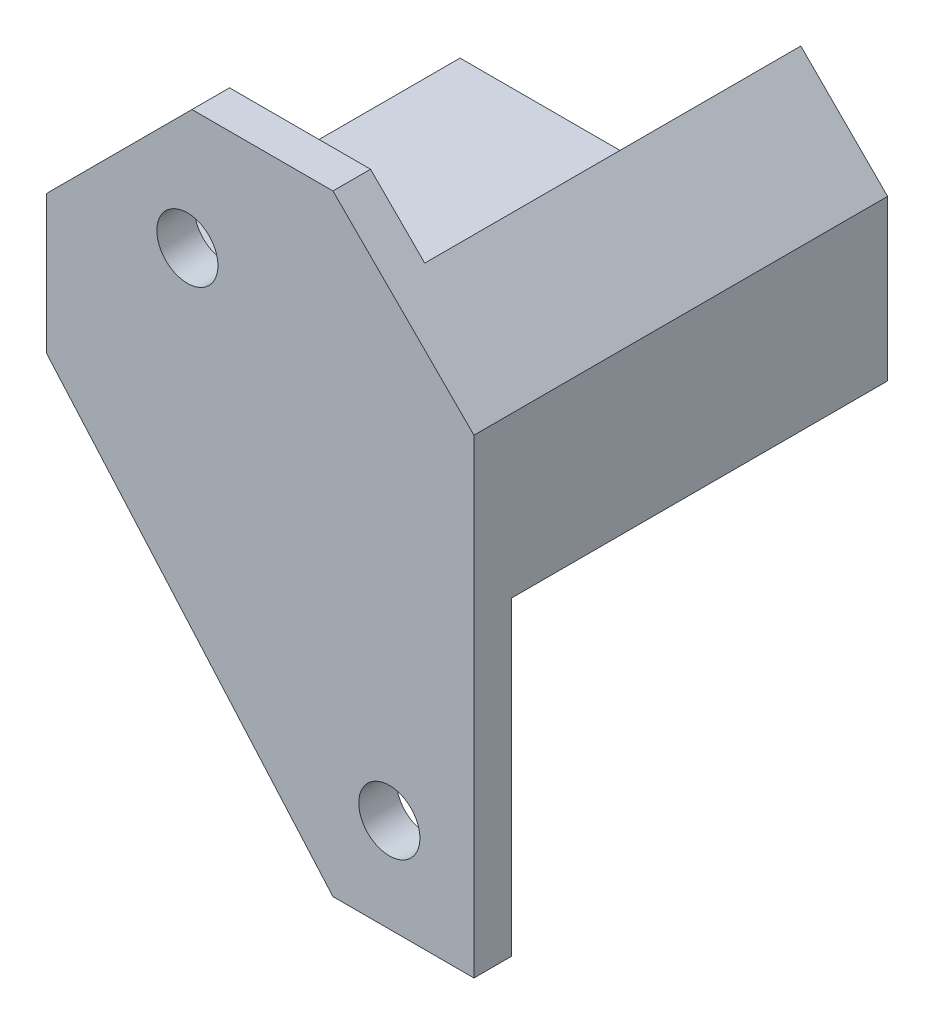
ISO-10303-21;
HEADER;
FILE_DESCRIPTION(('STEP AP214'),'2;1');
FILE_NAME('part.step','',(''),(''),'','','');
FILE_SCHEMA(('AUTOMOTIVE_DESIGN { 1 0 10303 214 1 1 1 1 }'));
ENDSEC;
DATA;
#1=APPLICATION_CONTEXT('core data for automotive mechanical design processes');
#2=APPLICATION_PROTOCOL_DEFINITION('international standard','automotive_design',2000,#1);
#3=PRODUCT_CONTEXT('',#1,'mechanical');
#4=PRODUCT('Part','Part','',(#3));
#5=PRODUCT_RELATED_PRODUCT_CATEGORY('part','',(#4));
#6=PRODUCT_DEFINITION_FORMATION('','',#4);
#7=PRODUCT_DEFINITION_CONTEXT('part definition',#1,'design');
#8=PRODUCT_DEFINITION('design','',#6,#7);
#9=PRODUCT_DEFINITION_SHAPE('','',#8);
#10=(LENGTH_UNIT() NAMED_UNIT(*) SI_UNIT(.MILLI.,.METRE.));
#11=(NAMED_UNIT(*) PLANE_ANGLE_UNIT() SI_UNIT($,.RADIAN.));
#12=(NAMED_UNIT(*) SI_UNIT($,.STERADIAN.) SOLID_ANGLE_UNIT());
#13=UNCERTAINTY_MEASURE_WITH_UNIT(LENGTH_MEASURE(1.E-05),#10,'distance_accuracy_value','');
#14=(GEOMETRIC_REPRESENTATION_CONTEXT(3) GLOBAL_UNCERTAINTY_ASSIGNED_CONTEXT((#13)) GLOBAL_UNIT_ASSIGNED_CONTEXT((#10,
#11,#12)) REPRESENTATION_CONTEXT('',''));
#15=CARTESIAN_POINT('',(0.,0.,0.));
#16=DIRECTION('',(0.,0.,1.));
#17=DIRECTION('',(1.,0.,0.));
#18=AXIS2_PLACEMENT_3D('',#15,#16,#17);
#19=CARTESIAN_POINT('',(-13.841173909257,21.1656260190921,4.));
#20=DIRECTION('',(0.,1.,0.));
#21=DIRECTION('',(0.,0.,1.));
#22=AXIS2_PLACEMENT_3D('',#19,#20,#21);
#23=PLANE('',#22);
#24=DIRECTION('',(0.,0.,-1.));
#25=VECTOR('',#24,1.);
#26=CARTESIAN_POINT('',(21.158826090743,21.1656260190921,4.));
#27=LINE('',#26,#25);
#28=CARTESIAN_POINT('',(21.158826090743,21.1656260190921,4.));
#29=VERTEX_POINT('',#28);
#30=CARTESIAN_POINT('',(21.158826090743,21.1656260190921,0.));
#31=VERTEX_POINT('',#30);
#32=EDGE_CURVE('E260',#29,#31,#27,.T.);
#33=ORIENTED_EDGE('',*,*,#32,.T.);
#34=DIRECTION('',(-1.,0.,0.));
#35=VECTOR('',#34,1.);
#36=CARTESIAN_POINT('',(-13.841173909257,21.1656260190921,0.));
#37=LINE('',#36,#35);
#38=CARTESIAN_POINT('',(6.15882609074331,21.1656260190921,0.));
#39=VERTEX_POINT('',#38);
#40=EDGE_CURVE('E55',#31,#39,#37,.T.);
#41=ORIENTED_EDGE('',*,*,#40,.T.);
#42=DIRECTION('',(0.,0.,1.));
#43=VECTOR('',#42,1.);
#44=CARTESIAN_POINT('',(6.15882609074331,21.1656260190921,4.));
#45=LINE('',#44,#43);
#46=CARTESIAN_POINT('',(6.15882609074331,21.1656260190921,4.));
#47=VERTEX_POINT('',#46);
#48=EDGE_CURVE('E245',#39,#47,#45,.T.);
#49=ORIENTED_EDGE('',*,*,#48,.T.);
#50=DIRECTION('',(1.,0.,0.));
#51=VECTOR('',#50,1.);
#52=CARTESIAN_POINT('',(-13.841173909257,21.1656260190921,4.));
#53=LINE('',#52,#51);
#54=EDGE_CURVE('E244',#47,#29,#53,.T.);
#55=ORIENTED_EDGE('',*,*,#54,.T.);
#56=EDGE_LOOP('',(#33,#41,#49,#55));
#57=FACE_BOUND('',#56,.T.);
#58=ADVANCED_FACE('F33',(#57),#23,.T.);
#59=CARTESIAN_POINT('',(-13.841173909257,1.16562601909198,4.));
#60=DIRECTION('',(0.707106781186544,-0.707106781186551,0.));
#61=DIRECTION('',(0.,0.,-1.));
#62=AXIS2_PLACEMENT_3D('',#59,#60,#61);
#63=PLANE('',#62);
#64=DIRECTION('',(0.,0.,1.));
#65=VECTOR('',#64,1.);
#66=CARTESIAN_POINT('',(-9.32054189023436,5.68625803811461,4.));
#67=LINE('',#66,#65);
#68=CARTESIAN_POINT('',(-9.32054189023436,5.68625803811461,4.));
#69=VERTEX_POINT('',#68);
#70=CARTESIAN_POINT('',(-9.32054189023436,5.68625803811461,0.));
#71=VERTEX_POINT('',#70);
#72=EDGE_CURVE('E47',#69,#71,#67,.F.);
#73=ORIENTED_EDGE('',*,*,#72,.F.);
#74=DIRECTION('',(0.707106781186551,0.707106781186544,0.));
#75=VECTOR('',#74,1.);
#76=CARTESIAN_POINT('',(-13.841173909257,1.16562601909198,4.));
#77=LINE('',#76,#75);
#78=EDGE_CURVE('E218',#47,#69,#77,.F.);
#79=ORIENTED_EDGE('',*,*,#78,.F.);
#80=ORIENTED_EDGE('',*,*,#48,.F.);
#81=DIRECTION('',(0.707106781186551,0.707106781186544,0.));
#82=VECTOR('',#81,1.);
#83=CARTESIAN_POINT('',(-13.841173909257,1.16562601909198,0.));
#84=LINE('',#83,#82);
#85=EDGE_CURVE('E326',#39,#71,#84,.F.);
#86=ORIENTED_EDGE('',*,*,#85,.T.);
#87=EDGE_LOOP('',(#73,#79,#80,#86));
#88=FACE_BOUND('',#87,.T.);
#89=ADVANCED_FACE('F325',(#88),#63,.F.);
#90=CARTESIAN_POINT('',(21.158826090743,-43.8343739809079,4.));
#91=DIRECTION('',(-0.752576694706878,-0.658504607868518,0.));
#92=DIRECTION('',(0.658504607868518,-0.752576694706878,0.));
#93=AXIS2_PLACEMENT_3D('',#90,#91,#92);
#94=PLANE('',#93);
#95=DIRECTION('',(0.,0.,1.));
#96=VECTOR('',#95,1.);
#97=CARTESIAN_POINT('',(-9.32054189023436,-9.00081057407665,4.));
#98=LINE('',#97,#96);
#99=CARTESIAN_POINT('',(-9.32054189023436,-9.00081057407667,-40.));
#100=VERTEX_POINT('',#99);
#101=CARTESIAN_POINT('',(-9.32054189023436,-9.00081057407666,4.));
#102=VERTEX_POINT('',#101);
#103=EDGE_CURVE('E198',#100,#102,#98,.T.);
#104=ORIENTED_EDGE('',*,*,#103,.F.);
#105=DIRECTION('',(-0.658504607868518,0.752576694706877,0.));
#106=VECTOR('',#105,1.);
#107=CARTESIAN_POINT('',(8.03382609074297,-28.8343739809079,-40.));
#108=LINE('',#107,#106);
#109=CARTESIAN_POINT('',(8.03382609074297,-28.8343739809079,-40.));
#110=VERTEX_POINT('',#109);
#111=EDGE_CURVE('E273',#110,#100,#108,.T.);
#112=ORIENTED_EDGE('',*,*,#111,.F.);
#113=DIRECTION('',(0.,0.,1.));
#114=VECTOR('',#113,1.);
#115=CARTESIAN_POINT('',(8.03382609074297,-28.8343739809079,-40.));
#116=LINE('',#115,#114);
#117=CARTESIAN_POINT('',(8.03382609074297,-28.8343739809079,0.));
#118=VERTEX_POINT('',#117);
#119=EDGE_CURVE('E238',#110,#118,#116,.T.);
#120=ORIENTED_EDGE('',*,*,#119,.T.);
#121=DIRECTION('',(-0.658504607868518,0.752576694706878,0.));
#122=VECTOR('',#121,1.);
#123=CARTESIAN_POINT('',(21.158826090743,-43.8343739809079,0.));
#124=LINE('',#123,#122);
#125=CARTESIAN_POINT('',(21.158826090743,-43.8343739809079,0.));
#126=VERTEX_POINT('',#125);
#127=EDGE_CURVE('E241',#126,#118,#124,.T.);
#128=ORIENTED_EDGE('',*,*,#127,.F.);
#129=DIRECTION('',(0.,0.,-1.));
#130=VECTOR('',#129,1.);
#131=CARTESIAN_POINT('',(21.158826090743,-43.8343739809079,4.));
#132=LINE('',#131,#130);
#133=CARTESIAN_POINT('',(21.158826090743,-43.8343739809079,4.));
#134=VERTEX_POINT('',#133);
#135=EDGE_CURVE('E224',#134,#126,#132,.T.);
#136=ORIENTED_EDGE('',*,*,#135,.F.);
#137=DIRECTION('',(-0.658504607868518,0.752576694706878,0.));
#138=VECTOR('',#137,1.);
#139=CARTESIAN_POINT('',(21.158826090743,-43.8343739809079,4.));
#140=LINE('',#139,#138);
#141=EDGE_CURVE('E215',#134,#102,#140,.T.);
#142=ORIENTED_EDGE('',*,*,#141,.T.);
#143=EDGE_LOOP('',(#104,#112,#120,#128,#136,#142));
#144=FACE_BOUND('',#143,.T.);
#145=CARTESIAN_POINT('',(-3.19509644070261,-16.0013196592558,-26.));
#146=DIRECTION('',(-0.752576694706878,-0.658504607868518,0.));
#147=DIRECTION('',(-0.658504607868518,0.752576694706878,0.));
#148=AXIS2_PLACEMENT_3D('',#145,#146,#147);
#149=ELLIPSE('',#148,5.58082655168537,4.19999999999976);
#150=CARTESIAN_POINT('',(-6.87009644070241,-11.801319659256,-26.));
#151=VERTEX_POINT('',#150);
#152=EDGE_CURVE('E267',#151,#151,#149,.T.);
#153=ORIENTED_EDGE('',*,*,#152,.F.);
#154=EDGE_LOOP('',(#153));
#155=FACE_BOUND('',#154,.T.);
#156=ADVANCED_FACE('F221',(#144,#155),#94,.T.);
#157=CARTESIAN_POINT('',(36.158826090743,-43.8343739809079,4.));
#158=DIRECTION('',(0.,-1.,0.));
#159=DIRECTION('',(0.,0.,-1.));
#160=AXIS2_PLACEMENT_3D('',#157,#158,#159);
#161=PLANE('',#160);
#162=DIRECTION('',(-1.,0.,0.));
#163=VECTOR('',#162,1.);
#164=CARTESIAN_POINT('',(36.158826090743,-43.8343739809079,0.));
#165=LINE('',#164,#163);
#166=CARTESIAN_POINT('',(36.158826090743,-43.8343739809079,0.));
#167=VERTEX_POINT('',#166);
#168=EDGE_CURVE('E237',#167,#126,#165,.T.);
#169=ORIENTED_EDGE('',*,*,#168,.F.);
#170=DIRECTION('',(0.,0.,-1.));
#171=VECTOR('',#170,1.);
#172=CARTESIAN_POINT('',(36.158826090743,-43.8343739809079,4.));
#173=LINE('',#172,#171);
#174=CARTESIAN_POINT('',(36.158826090743,-43.8343739809079,4.));
#175=VERTEX_POINT('',#174);
#176=EDGE_CURVE('E226',#175,#167,#173,.T.);
#177=ORIENTED_EDGE('',*,*,#176,.F.);
#178=DIRECTION('',(-1.,0.,0.));
#179=VECTOR('',#178,1.);
#180=CARTESIAN_POINT('',(36.158826090743,-43.8343739809079,4.));
#181=LINE('',#180,#179);
#182=EDGE_CURVE('E227',#175,#134,#181,.T.);
#183=ORIENTED_EDGE('',*,*,#182,.T.);
#184=ORIENTED_EDGE('',*,*,#135,.T.);
#185=EDGE_LOOP('',(#169,#177,#183,#184));
#186=FACE_BOUND('',#185,.T.);
#187=ADVANCED_FACE('F303',(#186),#161,.T.);
#188=CARTESIAN_POINT('',(36.158826090743,21.1656260190921,4.));
#189=DIRECTION('',(1.,0.,0.));
#190=DIRECTION('',(0.,0.,-1.));
#191=AXIS2_PLACEMENT_3D('',#188,#189,#190);
#192=PLANE('',#191);
#193=DIRECTION('',(0.,-1.,0.));
#194=VECTOR('',#193,1.);
#195=CARTESIAN_POINT('',(36.158826090743,21.1656260190921,-40.));
#196=LINE('',#195,#194);
#197=CARTESIAN_POINT('',(36.158826090743,6.16562601909207,-40.));
#198=VERTEX_POINT('',#197);
#199=CARTESIAN_POINT('',(36.158826090743,-10.8343739809078,-40.));
#200=VERTEX_POINT('',#199);
#201=EDGE_CURVE('E287',#198,#200,#196,.T.);
#202=ORIENTED_EDGE('',*,*,#201,.F.);
#203=DIRECTION('',(0.,0.,1.));
#204=VECTOR('',#203,1.);
#205=CARTESIAN_POINT('',(36.158826090743,6.16562601909207,4.));
#206=LINE('',#205,#204);
#207=CARTESIAN_POINT('',(36.158826090743,6.16562601909207,4.));
#208=VERTEX_POINT('',#207);
#209=EDGE_CURVE('E265',#198,#208,#206,.T.);
#210=ORIENTED_EDGE('',*,*,#209,.T.);
#211=DIRECTION('',(0.,-1.,0.));
#212=VECTOR('',#211,1.);
#213=CARTESIAN_POINT('',(36.158826090743,21.1656260190921,4.));
#214=LINE('',#213,#212);
#215=EDGE_CURVE('E231',#208,#175,#214,.T.);
#216=ORIENTED_EDGE('',*,*,#215,.T.);
#217=ORIENTED_EDGE('',*,*,#176,.T.);
#218=DIRECTION('',(0.,-1.,0.));
#219=VECTOR('',#218,1.);
#220=CARTESIAN_POINT('',(36.158826090743,21.1656260190921,0.));
#221=LINE('',#220,#219);
#222=CARTESIAN_POINT('',(36.158826090743,-10.8343739809078,0.));
#223=VERTEX_POINT('',#222);
#224=EDGE_CURVE('E235',#223,#167,#221,.T.);
#225=ORIENTED_EDGE('',*,*,#224,.F.);
#226=DIRECTION('',(0.,0.,-1.));
#227=VECTOR('',#226,1.);
#228=CARTESIAN_POINT('',(36.158826090743,-10.8343739809078,-40.));
#229=LINE('',#228,#227);
#230=EDGE_CURVE('E252',#223,#200,#229,.T.);
#231=ORIENTED_EDGE('',*,*,#230,.T.);
#232=EDGE_LOOP('',(#202,#210,#216,#217,#225,#231));
#233=FACE_BOUND('',#232,.T.);
#234=ADVANCED_FACE('F298',(#233),#192,.T.);
#235=CARTESIAN_POINT('',(0.,0.,4.));
#236=DIRECTION('',(0.,0.,-1.));
#237=DIRECTION('',(-1.,0.,0.));
#238=AXIS2_PLACEMENT_3D('',#235,#236,#237);
#239=PLANE('',#238);
#240=CARTESIAN_POINT('',(27.158826090743,-33.8343739809079,4.));
#241=DIRECTION('',(0.,0.,-1.));
#242=DIRECTION('',(-1.,0.,0.));
#243=AXIS2_PLACEMENT_3D('',#240,#241,#242);
#244=CIRCLE('',#243,3.25);
#245=CARTESIAN_POINT('',(23.908826090743,-33.8343739809079,4.));
#246=VERTEX_POINT('',#245);
#247=EDGE_CURVE('E743',#246,#246,#244,.T.);
#248=ORIENTED_EDGE('',*,*,#247,.T.);
#249=EDGE_LOOP('',(#248));
#250=FACE_BOUND('',#249,.T.);
#251=CARTESIAN_POINT('',(5.67945810976564,8.16562601909212,4.));
#252=DIRECTION('',(0.,0.,-1.));
#253=DIRECTION('',(-1.,0.,0.));
#254=AXIS2_PLACEMENT_3D('',#251,#252,#253);
#255=CIRCLE('',#254,3.25);
#256=CARTESIAN_POINT('',(2.42945810976564,8.16562601909212,4.));
#257=VERTEX_POINT('',#256);
#258=EDGE_CURVE('E747',#257,#257,#255,.T.);
#259=ORIENTED_EDGE('',*,*,#258,.T.);
#260=EDGE_LOOP('',(#259));
#261=FACE_BOUND('',#260,.T.);
#262=ORIENTED_EDGE('',*,*,#78,.T.);
#263=DIRECTION('',(0.,1.,0.));
#264=VECTOR('',#263,1.);
#265=CARTESIAN_POINT('',(-9.32054189023436,6.85240181950718,4.));
#266=LINE('',#265,#264);
#267=EDGE_CURVE('E201',#102,#69,#266,.T.);
#268=ORIENTED_EDGE('',*,*,#267,.F.);
#269=ORIENTED_EDGE('',*,*,#141,.F.);
#270=ORIENTED_EDGE('',*,*,#182,.F.);
#271=ORIENTED_EDGE('',*,*,#215,.F.);
#272=DIRECTION('',(0.707106781186546,-0.707106781186549,0.));
#273=VECTOR('',#272,1.);
#274=CARTESIAN_POINT('',(21.158826090743,21.1656260190921,4.));
#275=LINE('',#274,#273);
#276=EDGE_CURVE('E41',#208,#29,#275,.F.);
#277=ORIENTED_EDGE('',*,*,#276,.T.);
#278=ORIENTED_EDGE('',*,*,#54,.F.);
#279=EDGE_LOOP('',(#262,#268,#269,#270,#271,#277,#278));
#280=FACE_BOUND('',#279,.T.);
#281=ADVANCED_FACE('F213',(#250,#261,#280),#239,.F.);
#282=CARTESIAN_POINT('',(0.,0.,0.));
#283=DIRECTION('',(0.,0.,-1.));
#284=DIRECTION('',(-1.,0.,0.));
#285=AXIS2_PLACEMENT_3D('',#282,#283,#284);
#286=PLANE('',#285);
#287=CARTESIAN_POINT('',(27.158826090743,-33.8343739809079,0.));
#288=DIRECTION('',(0.,0.,-1.));
#289=DIRECTION('',(-1.,0.,0.));
#290=AXIS2_PLACEMENT_3D('',#287,#288,#289);
#291=CIRCLE('',#290,3.25);
#292=CARTESIAN_POINT('',(23.908826090743,-33.8343739809079,0.));
#293=VERTEX_POINT('',#292);
#294=EDGE_CURVE('E746',#293,#293,#291,.T.);
#295=ORIENTED_EDGE('',*,*,#294,.F.);
#296=EDGE_LOOP('',(#295));
#297=FACE_BOUND('',#296,.T.);
#298=DIRECTION('',(-1.,0.,0.));
#299=VECTOR('',#298,1.);
#300=CARTESIAN_POINT('',(36.158826090743,-28.8343739809079,0.));
#301=LINE('',#300,#299);
#302=CARTESIAN_POINT('',(18.158826090743,-28.8343739809079,0.));
#303=VERTEX_POINT('',#302);
#304=EDGE_CURVE('E269',#303,#118,#301,.T.);
#305=ORIENTED_EDGE('',*,*,#304,.F.);
#306=DIRECTION('',(0.707106781186546,0.707106781186549,0.));
#307=VECTOR('',#306,1.);
#308=CARTESIAN_POINT('',(18.158826090743,-28.8343739809079,0.));
#309=LINE('',#308,#307);
#310=EDGE_CURVE('E257',#303,#223,#309,.T.);
#311=ORIENTED_EDGE('',*,*,#310,.T.);
#312=ORIENTED_EDGE('',*,*,#224,.T.);
#313=ORIENTED_EDGE('',*,*,#168,.T.);
#314=ORIENTED_EDGE('',*,*,#127,.T.);
#315=EDGE_LOOP('',(#305,#311,#312,#313,#314));
#316=FACE_BOUND('',#315,.T.);
#317=ADVANCED_FACE('F306',(#297,#316),#286,.T.);
#318=CARTESIAN_POINT('',(36.158826090743,-28.8343739809079,-40.));
#319=DIRECTION('',(0.,1.,0.));
#320=DIRECTION('',(0.,0.,1.));
#321=AXIS2_PLACEMENT_3D('',#318,#319,#320);
#322=PLANE('',#321);
#323=DIRECTION('',(-1.,0.,0.));
#324=VECTOR('',#323,1.);
#325=CARTESIAN_POINT('',(36.158826090743,-28.8343739809079,-40.));
#326=LINE('',#325,#324);
#327=CARTESIAN_POINT('',(18.158826090743,-28.8343739809079,-40.));
#328=VERTEX_POINT('',#327);
#329=EDGE_CURVE('E289',#328,#110,#326,.T.);
#330=ORIENTED_EDGE('',*,*,#329,.F.);
#331=DIRECTION('',(0.,0.,1.));
#332=VECTOR('',#331,1.);
#333=CARTESIAN_POINT('',(18.158826090743,-28.8343739809079,0.));
#334=LINE('',#333,#332);
#335=EDGE_CURVE('E249',#328,#303,#334,.T.);
#336=ORIENTED_EDGE('',*,*,#335,.T.);
#337=ORIENTED_EDGE('',*,*,#304,.T.);
#338=ORIENTED_EDGE('',*,*,#119,.F.);
#339=EDGE_LOOP('',(#330,#336,#337,#338));
#340=FACE_BOUND('',#339,.T.);
#341=ADVANCED_FACE('F310',(#340),#322,.F.);
#342=CARTESIAN_POINT('',(0.,0.,-40.));
#343=DIRECTION('',(0.,0.,-1.));
#344=DIRECTION('',(-1.,0.,0.));
#345=AXIS2_PLACEMENT_3D('',#342,#343,#344);
#346=PLANE('',#345);
#347=DIRECTION('',(0.,-1.,0.));
#348=VECTOR('',#347,1.);
#349=CARTESIAN_POINT('',(-9.32054189023436,6.85240181950718,-40.));
#350=LINE('',#349,#348);
#351=CARTESIAN_POINT('',(-9.32054189023436,-3.83437398090789,-40.));
#352=VERTEX_POINT('',#351);
#353=EDGE_CURVE('E203',#352,#100,#350,.T.);
#354=ORIENTED_EDGE('',*,*,#353,.F.);
#355=DIRECTION('',(-1.,0.,0.));
#356=VECTOR('',#355,1.);
#357=CARTESIAN_POINT('',(7.69050141032104,-3.83437398090789,-40.));
#358=LINE('',#357,#356);
#359=CARTESIAN_POINT('',(7.69050141032104,-3.83437398090789,-40.));
#360=VERTEX_POINT('',#359);
#361=EDGE_CURVE('E208',#360,#352,#358,.T.);
#362=ORIENTED_EDGE('',*,*,#361,.F.);
#363=DIRECTION('',(-0.707106781186547,-0.707106781186548,0.));
#364=VECTOR('',#363,1.);
#365=CARTESIAN_POINT('',(26.924663750532,15.3997883593031,-40.));
#366=LINE('',#365,#364);
#367=CARTESIAN_POINT('',(26.924663750532,15.3997883593031,-40.));
#368=VERTEX_POINT('',#367);
#369=EDGE_CURVE('E342',#368,#360,#366,.T.);
#370=ORIENTED_EDGE('',*,*,#369,.F.);
#371=DIRECTION('',(-0.707106781186546,0.707106781186549,0.));
#372=VECTOR('',#371,1.);
#373=CARTESIAN_POINT('',(21.1622260549176,21.1622260549175,-40.));
#374=LINE('',#373,#372);
#375=EDGE_CURVE('E263',#368,#198,#374,.F.);
#376=ORIENTED_EDGE('',*,*,#375,.T.);
#377=ORIENTED_EDGE('',*,*,#201,.T.);
#378=DIRECTION('',(-0.707106781186546,-0.707106781186549,0.));
#379=VECTOR('',#378,1.);
#380=CARTESIAN_POINT('',(23.4966000358255,-23.4966000358254,-40.));
#381=LINE('',#380,#379);
#382=EDGE_CURVE('E255',#200,#328,#381,.T.);
#383=ORIENTED_EDGE('',*,*,#382,.T.);
#384=ORIENTED_EDGE('',*,*,#329,.T.);
#385=ORIENTED_EDGE('',*,*,#111,.T.);
#386=EDGE_LOOP('',(#354,#362,#370,#376,#377,#383,#384,#385));
#387=FACE_BOUND('',#386,.T.);
#388=DIRECTION('',(0.866025403784439,0.5,0.));
#389=VECTOR('',#388,1.);
#390=CARTESIAN_POINT('',(21.958826090743,-0.409502850311449,-40.));
#391=LINE('',#390,#389);
#392=CARTESIAN_POINT('',(21.958826090743,-0.409502850311449,-40.));
#393=VERTEX_POINT('',#392);
#394=CARTESIAN_POINT('',(26.158826090743,2.01536828028498,-40.));
#395=VERTEX_POINT('',#394);
#396=EDGE_CURVE('E349',#393,#395,#391,.T.);
#397=ORIENTED_EDGE('',*,*,#396,.F.);
#398=DIRECTION('',(0.,1.,0.));
#399=VECTOR('',#398,1.);
#400=CARTESIAN_POINT('',(21.958826090743,-5.25924511150431,-40.));
#401=LINE('',#400,#399);
#402=CARTESIAN_POINT('',(21.958826090743,-5.25924511150431,-40.));
#403=VERTEX_POINT('',#402);
#404=EDGE_CURVE('E354',#403,#393,#401,.T.);
#405=ORIENTED_EDGE('',*,*,#404,.F.);
#406=DIRECTION('',(-0.866025403784439,0.5,0.));
#407=VECTOR('',#406,1.);
#408=CARTESIAN_POINT('',(26.158826090743,-7.68411624210074,-40.));
#409=LINE('',#408,#407);
#410=CARTESIAN_POINT('',(26.158826090743,-7.68411624210074,-40.));
#411=VERTEX_POINT('',#410);
#412=EDGE_CURVE('E380',#411,#403,#409,.T.);
#413=ORIENTED_EDGE('',*,*,#412,.F.);
#414=DIRECTION('',(-0.866025403784439,-0.5,0.));
#415=VECTOR('',#414,1.);
#416=CARTESIAN_POINT('',(30.358826090743,-5.25924511150431,-40.));
#417=LINE('',#416,#415);
#418=CARTESIAN_POINT('',(30.358826090743,-5.25924511150431,-40.));
#419=VERTEX_POINT('',#418);
#420=EDGE_CURVE('E377',#419,#411,#417,.T.);
#421=ORIENTED_EDGE('',*,*,#420,.F.);
#422=DIRECTION('',(0.,-1.,0.));
#423=VECTOR('',#422,1.);
#424=CARTESIAN_POINT('',(30.358826090743,-0.409502850311446,-40.));
#425=LINE('',#424,#423);
#426=CARTESIAN_POINT('',(30.358826090743,-0.409502850311446,-40.));
#427=VERTEX_POINT('',#426);
#428=EDGE_CURVE('E374',#427,#419,#425,.T.);
#429=ORIENTED_EDGE('',*,*,#428,.F.);
#430=DIRECTION('',(0.866025403784439,-0.5,0.));
#431=VECTOR('',#430,1.);
#432=CARTESIAN_POINT('',(26.158826090743,2.01536828028498,-40.));
#433=LINE('',#432,#431);
#434=EDGE_CURVE('E371',#395,#427,#433,.T.);
#435=ORIENTED_EDGE('',*,*,#434,.F.);
#436=EDGE_LOOP('',(#397,#405,#413,#421,#429,#435));
#437=FACE_BOUND('',#436,.T.);
#438=DIRECTION('',(0.866025403784438,0.5,0.));
#439=VECTOR('',#438,1.);
#440=CARTESIAN_POINT('',(5.95882609074296,-15.4095028503115,-40.));
#441=LINE('',#440,#439);
#442=CARTESIAN_POINT('',(5.95882609074296,-15.4095028503115,-40.));
#443=VERTEX_POINT('',#442);
#444=CARTESIAN_POINT('',(10.158826090743,-12.984631719715,-40.));
#445=VERTEX_POINT('',#444);
#446=EDGE_CURVE('E387',#443,#445,#441,.T.);
#447=ORIENTED_EDGE('',*,*,#446,.F.);
#448=DIRECTION('',(0.,1.,0.));
#449=VECTOR('',#448,1.);
#450=CARTESIAN_POINT('',(5.95882609074296,-20.2592451115043,-40.));
#451=LINE('',#450,#449);
#452=CARTESIAN_POINT('',(5.95882609074296,-20.2592451115043,-40.));
#453=VERTEX_POINT('',#452);
#454=EDGE_CURVE('E402',#453,#443,#451,.T.);
#455=ORIENTED_EDGE('',*,*,#454,.F.);
#456=DIRECTION('',(-0.866025403784439,0.5,0.));
#457=VECTOR('',#456,1.);
#458=CARTESIAN_POINT('',(10.158826090743,-22.6841162421007,-40.));
#459=LINE('',#458,#457);
#460=CARTESIAN_POINT('',(10.158826090743,-22.6841162421007,-40.));
#461=VERTEX_POINT('',#460);
#462=EDGE_CURVE('E427',#461,#453,#459,.T.);
#463=ORIENTED_EDGE('',*,*,#462,.F.);
#464=DIRECTION('',(-0.866025403784439,-0.5,0.));
#465=VECTOR('',#464,1.);
#466=CARTESIAN_POINT('',(14.358826090743,-20.2592451115043,-40.));
#467=LINE('',#466,#465);
#468=CARTESIAN_POINT('',(14.358826090743,-20.2592451115043,-40.));
#469=VERTEX_POINT('',#468);
#470=EDGE_CURVE('E424',#469,#461,#467,.T.);
#471=ORIENTED_EDGE('',*,*,#470,.F.);
#472=DIRECTION('',(0.,-1.,0.));
#473=VECTOR('',#472,1.);
#474=CARTESIAN_POINT('',(14.358826090743,-15.4095028503114,-40.));
#475=LINE('',#474,#473);
#476=CARTESIAN_POINT('',(14.358826090743,-15.4095028503114,-40.));
#477=VERTEX_POINT('',#476);
#478=EDGE_CURVE('E421',#477,#469,#475,.T.);
#479=ORIENTED_EDGE('',*,*,#478,.F.);
#480=DIRECTION('',(0.866025403784439,-0.5,0.));
#481=VECTOR('',#480,1.);
#482=CARTESIAN_POINT('',(10.158826090743,-12.984631719715,-40.));
#483=LINE('',#482,#481);
#484=EDGE_CURVE('E418',#445,#477,#483,.T.);
#485=ORIENTED_EDGE('',*,*,#484,.F.);
#486=EDGE_LOOP('',(#447,#455,#463,#471,#479,#485));
#487=FACE_BOUND('',#486,.T.);
#488=ADVANCED_FACE('F449',(#387,#437,#487),#346,.T.);
#489=CARTESIAN_POINT('',(18.158826090743,-28.8343739809079,-40.));
#490=DIRECTION('',(0.707106781186549,-0.707106781186546,0.));
#491=DIRECTION('',(0.,0.,-1.));
#492=AXIS2_PLACEMENT_3D('',#489,#490,#491);
#493=PLANE('',#492);
#494=ORIENTED_EDGE('',*,*,#382,.F.);
#495=ORIENTED_EDGE('',*,*,#230,.F.);
#496=ORIENTED_EDGE('',*,*,#310,.F.);
#497=ORIENTED_EDGE('',*,*,#335,.F.);
#498=EDGE_LOOP('',(#494,#495,#496,#497));
#499=FACE_BOUND('',#498,.T.);
#500=ADVANCED_FACE('F315',(#499),#493,.T.);
#501=CARTESIAN_POINT('',(21.158826090743,21.1656260190921,4.));
#502=DIRECTION('',(-0.707106781186549,-0.707106781186546,0.));
#503=DIRECTION('',(0.,0.,-1.));
#504=AXIS2_PLACEMENT_3D('',#501,#502,#503);
#505=PLANE('',#504);
#506=DIRECTION('',(0.,0.,-1.));
#507=VECTOR('',#506,1.);
#508=CARTESIAN_POINT('',(26.924663750532,15.3997883593031,47.8210572876037));
#509=LINE('',#508,#507);
#510=CARTESIAN_POINT('',(26.924663750532,15.3997883593031,0.));
#511=VERTEX_POINT('',#510);
#512=EDGE_CURVE('E345',#511,#368,#509,.T.);
#513=ORIENTED_EDGE('',*,*,#512,.F.);
#514=DIRECTION('',(-0.707106781186546,0.707106781186549,0.));
#515=VECTOR('',#514,1.);
#516=CARTESIAN_POINT('',(21.158826090743,21.1656260190921,0.));
#517=LINE('',#516,#515);
#518=EDGE_CURVE('E333',#511,#31,#517,.T.);
#519=ORIENTED_EDGE('',*,*,#518,.T.);
#520=ORIENTED_EDGE('',*,*,#32,.F.);
#521=ORIENTED_EDGE('',*,*,#276,.F.);
#522=ORIENTED_EDGE('',*,*,#209,.F.);
#523=ORIENTED_EDGE('',*,*,#375,.F.);
#524=EDGE_LOOP('',(#513,#519,#520,#521,#522,#523));
#525=FACE_BOUND('',#524,.T.);
#526=ADVANCED_FACE('F35',(#525),#505,.F.);
#527=CARTESIAN_POINT('',(16.158826090743,-16.0013196592558,-26.));
#528=DIRECTION('',(-1.,0.,0.));
#529=DIRECTION('',(0.,0.,1.));
#530=AXIS2_PLACEMENT_3D('',#527,#528,#529);
#531=CYLINDRICAL_SURFACE('',#530,4.19999999999976);
#532=ORIENTED_EDGE('',*,*,#152,.T.);
#533=EDGE_LOOP('',(#532));
#534=FACE_BOUND('',#533,.T.);
#535=CARTESIAN_POINT('',(16.158826090743,-16.0013196592558,-26.));
#536=DIRECTION('',(-1.,0.,0.));
#537=DIRECTION('',(0.,0.,1.));
#538=AXIS2_PLACEMENT_3D('',#535,#536,#537);
#539=CIRCLE('',#538,4.19999999999976);
#540=CARTESIAN_POINT('',(16.158826090743,-16.0013196592558,-21.8000000000002));
#541=VERTEX_POINT('',#540);
#542=EDGE_CURVE('E270',#541,#541,#539,.T.);
#543=ORIENTED_EDGE('',*,*,#542,.F.);
#544=EDGE_LOOP('',(#543));
#545=FACE_BOUND('',#544,.T.);
#546=ADVANCED_FACE('F487',(#534,#545),#531,.F.);
#547=CARTESIAN_POINT('',(16.158826090743,-16.0013196592558,-26.));
#548=DIRECTION('',(-1.,0.,0.));
#549=DIRECTION('',(0.,0.,1.));
#550=AXIS2_PLACEMENT_3D('',#547,#548,#549);
#551=PLANE('',#550);
#552=ORIENTED_EDGE('',*,*,#542,.T.);
#553=EDGE_LOOP('',(#552));
#554=FACE_BOUND('',#553,.T.);
#555=ADVANCED_FACE('F549',(#554),#551,.T.);
#556=CARTESIAN_POINT('',(5.95882609074296,-15.4095028503115,-35.));
#557=DIRECTION('',(-0.5,0.866025403784438,0.));
#558=DIRECTION('',(-0.866025403784439,-0.5,0.));
#559=AXIS2_PLACEMENT_3D('',#556,#557,#558);
#560=PLANE('',#559);
#561=ORIENTED_EDGE('',*,*,#446,.T.);
#562=DIRECTION('',(0.,0.,-1.));
#563=VECTOR('',#562,1.);
#564=CARTESIAN_POINT('',(10.158826090743,-12.984631719715,-35.));
#565=LINE('',#564,#563);
#566=CARTESIAN_POINT('',(10.158826090743,-12.984631719715,-35.));
#567=VERTEX_POINT('',#566);
#568=EDGE_CURVE('E284',#567,#445,#565,.T.);
#569=ORIENTED_EDGE('',*,*,#568,.F.);
#570=DIRECTION('',(0.866025403784438,0.5,0.));
#571=VECTOR('',#570,1.);
#572=CARTESIAN_POINT('',(5.95882609074296,-15.4095028503115,-35.));
#573=LINE('',#572,#571);
#574=CARTESIAN_POINT('',(5.95882609074296,-15.4095028503115,-35.));
#575=VERTEX_POINT('',#574);
#576=EDGE_CURVE('E398',#575,#567,#573,.T.);
#577=ORIENTED_EDGE('',*,*,#576,.F.);
#578=DIRECTION('',(0.,0.,-1.));
#579=VECTOR('',#578,1.);
#580=CARTESIAN_POINT('',(5.95882609074296,-15.4095028503115,-35.));
#581=LINE('',#580,#579);
#582=EDGE_CURVE('E276',#575,#443,#581,.T.);
#583=ORIENTED_EDGE('',*,*,#582,.T.);
#584=EDGE_LOOP('',(#561,#569,#577,#583));
#585=FACE_BOUND('',#584,.T.);
#586=ADVANCED_FACE('F461',(#585),#560,.F.);
#587=CARTESIAN_POINT('',(5.95882609074296,-20.2592451115043,-35.));
#588=DIRECTION('',(-1.,0.,0.));
#589=DIRECTION('',(0.,0.,1.));
#590=AXIS2_PLACEMENT_3D('',#587,#588,#589);
#591=PLANE('',#590);
#592=ORIENTED_EDGE('',*,*,#454,.T.);
#593=ORIENTED_EDGE('',*,*,#582,.F.);
#594=DIRECTION('',(0.,1.,0.));
#595=VECTOR('',#594,1.);
#596=CARTESIAN_POINT('',(5.95882609074296,-20.2592451115043,-35.));
#597=LINE('',#596,#595);
#598=CARTESIAN_POINT('',(5.95882609074296,-20.2592451115043,-35.));
#599=VERTEX_POINT('',#598);
#600=EDGE_CURVE('E414',#599,#575,#597,.T.);
#601=ORIENTED_EDGE('',*,*,#600,.F.);
#602=DIRECTION('',(0.,0.,-1.));
#603=VECTOR('',#602,1.);
#604=CARTESIAN_POINT('',(5.95882609074296,-20.2592451115043,-35.));
#605=LINE('',#604,#603);
#606=EDGE_CURVE('E280',#599,#453,#605,.T.);
#607=ORIENTED_EDGE('',*,*,#606,.T.);
#608=EDGE_LOOP('',(#592,#593,#601,#607));
#609=FACE_BOUND('',#608,.T.);
#610=ADVANCED_FACE('F463',(#609),#591,.F.);
#611=CARTESIAN_POINT('',(10.158826090743,-22.6841162421007,-35.));
#612=DIRECTION('',(-0.5,-0.866025403784439,0.));
#613=DIRECTION('',(0.866025403784439,-0.5,0.));
#614=AXIS2_PLACEMENT_3D('',#611,#612,#613);
#615=PLANE('',#614);
#616=ORIENTED_EDGE('',*,*,#462,.T.);
#617=ORIENTED_EDGE('',*,*,#606,.F.);
#618=DIRECTION('',(-0.866025403784439,0.5,0.));
#619=VECTOR('',#618,1.);
#620=CARTESIAN_POINT('',(10.158826090743,-22.6841162421007,-35.));
#621=LINE('',#620,#619);
#622=CARTESIAN_POINT('',(10.158826090743,-22.6841162421007,-35.));
#623=VERTEX_POINT('',#622);
#624=EDGE_CURVE('E411',#623,#599,#621,.T.);
#625=ORIENTED_EDGE('',*,*,#624,.F.);
#626=DIRECTION('',(0.,0.,-1.));
#627=VECTOR('',#626,1.);
#628=CARTESIAN_POINT('',(10.158826090743,-22.6841162421007,-35.));
#629=LINE('',#628,#627);
#630=EDGE_CURVE('E433',#623,#461,#629,.T.);
#631=ORIENTED_EDGE('',*,*,#630,.T.);
#632=EDGE_LOOP('',(#616,#617,#625,#631));
#633=FACE_BOUND('',#632,.T.);
#634=ADVANCED_FACE('F465',(#633),#615,.F.);
#635=CARTESIAN_POINT('',(14.358826090743,-20.2592451115043,-35.));
#636=DIRECTION('',(0.5,-0.866025403784439,0.));
#637=DIRECTION('',(0.866025403784439,0.5,0.));
#638=AXIS2_PLACEMENT_3D('',#635,#636,#637);
#639=PLANE('',#638);
#640=ORIENTED_EDGE('',*,*,#470,.T.);
#641=ORIENTED_EDGE('',*,*,#630,.F.);
#642=DIRECTION('',(-0.866025403784439,-0.5,0.));
#643=VECTOR('',#642,1.);
#644=CARTESIAN_POINT('',(14.358826090743,-20.2592451115043,-35.));
#645=LINE('',#644,#643);
#646=CARTESIAN_POINT('',(14.358826090743,-20.2592451115043,-35.));
#647=VERTEX_POINT('',#646);
#648=EDGE_CURVE('E408',#647,#623,#645,.T.);
#649=ORIENTED_EDGE('',*,*,#648,.F.);
#650=DIRECTION('',(0.,0.,-1.));
#651=VECTOR('',#650,1.);
#652=CARTESIAN_POINT('',(14.358826090743,-20.2592451115043,-35.));
#653=LINE('',#652,#651);
#654=EDGE_CURVE('E435',#647,#469,#653,.T.);
#655=ORIENTED_EDGE('',*,*,#654,.T.);
#656=EDGE_LOOP('',(#640,#641,#649,#655));
#657=FACE_BOUND('',#656,.T.);
#658=ADVANCED_FACE('F456',(#657),#639,.F.);
#659=CARTESIAN_POINT('',(14.358826090743,-15.4095028503114,-35.));
#660=DIRECTION('',(1.,0.,0.));
#661=DIRECTION('',(0.,0.,-1.));
#662=AXIS2_PLACEMENT_3D('',#659,#660,#661);
#663=PLANE('',#662);
#664=ORIENTED_EDGE('',*,*,#478,.T.);
#665=ORIENTED_EDGE('',*,*,#654,.F.);
#666=DIRECTION('',(0.,-1.,0.));
#667=VECTOR('',#666,1.);
#668=CARTESIAN_POINT('',(14.358826090743,-15.4095028503114,-35.));
#669=LINE('',#668,#667);
#670=CARTESIAN_POINT('',(14.358826090743,-15.4095028503114,-35.));
#671=VERTEX_POINT('',#670);
#672=EDGE_CURVE('E405',#671,#647,#669,.T.);
#673=ORIENTED_EDGE('',*,*,#672,.F.);
#674=DIRECTION('',(0.,0.,-1.));
#675=VECTOR('',#674,1.);
#676=CARTESIAN_POINT('',(14.358826090743,-15.4095028503114,-35.));
#677=LINE('',#676,#675);
#678=EDGE_CURVE('E436',#671,#477,#677,.T.);
#679=ORIENTED_EDGE('',*,*,#678,.T.);
#680=EDGE_LOOP('',(#664,#665,#673,#679));
#681=FACE_BOUND('',#680,.T.);
#682=ADVANCED_FACE('F453',(#681),#663,.F.);
#683=CARTESIAN_POINT('',(10.158826090743,-12.984631719715,-35.));
#684=DIRECTION('',(0.5,0.866025403784439,0.));
#685=DIRECTION('',(-0.866025403784439,0.5,0.));
#686=AXIS2_PLACEMENT_3D('',#683,#684,#685);
#687=PLANE('',#686);
#688=ORIENTED_EDGE('',*,*,#484,.T.);
#689=ORIENTED_EDGE('',*,*,#678,.F.);
#690=DIRECTION('',(0.866025403784439,-0.5,0.));
#691=VECTOR('',#690,1.);
#692=CARTESIAN_POINT('',(10.158826090743,-12.984631719715,-35.));
#693=LINE('',#692,#691);
#694=EDGE_CURVE('E401',#567,#671,#693,.T.);
#695=ORIENTED_EDGE('',*,*,#694,.F.);
#696=ORIENTED_EDGE('',*,*,#568,.T.);
#697=EDGE_LOOP('',(#688,#689,#695,#696));
#698=FACE_BOUND('',#697,.T.);
#699=ADVANCED_FACE('F443',(#698),#687,.F.);
#700=CARTESIAN_POINT('',(0.,0.,-35.));
#701=DIRECTION('',(0.,0.,-1.));
#702=DIRECTION('',(-1.,0.,0.));
#703=AXIS2_PLACEMENT_3D('',#700,#701,#702);
#704=PLANE('',#703);
#705=ORIENTED_EDGE('',*,*,#576,.T.);
#706=ORIENTED_EDGE('',*,*,#694,.T.);
#707=ORIENTED_EDGE('',*,*,#672,.T.);
#708=ORIENTED_EDGE('',*,*,#648,.T.);
#709=ORIENTED_EDGE('',*,*,#624,.T.);
#710=ORIENTED_EDGE('',*,*,#600,.T.);
#711=EDGE_LOOP('',(#705,#706,#707,#708,#709,#710));
#712=FACE_BOUND('',#711,.T.);
#713=ADVANCED_FACE('F459',(#712),#704,.T.);
#714=CARTESIAN_POINT('',(21.958826090743,-0.409502850311449,-35.));
#715=DIRECTION('',(-0.5,0.866025403784438,0.));
#716=DIRECTION('',(-0.866025403784439,-0.5,0.));
#717=AXIS2_PLACEMENT_3D('',#714,#715,#716);
#718=PLANE('',#717);
#719=ORIENTED_EDGE('',*,*,#396,.T.);
#720=DIRECTION('',(0.,0.,-1.));
#721=VECTOR('',#720,1.);
#722=CARTESIAN_POINT('',(26.158826090743,2.01536828028498,-35.));
#723=LINE('',#722,#721);
#724=CARTESIAN_POINT('',(26.158826090743,2.01536828028498,-35.));
#725=VERTEX_POINT('',#724);
#726=EDGE_CURVE('E369',#725,#395,#723,.T.);
#727=ORIENTED_EDGE('',*,*,#726,.F.);
#728=DIRECTION('',(0.866025403784439,0.5,0.));
#729=VECTOR('',#728,1.);
#730=CARTESIAN_POINT('',(21.958826090743,-0.409502850311449,-35.));
#731=LINE('',#730,#729);
#732=CARTESIAN_POINT('',(21.958826090743,-0.409502850311449,-35.));
#733=VERTEX_POINT('',#732);
#734=EDGE_CURVE('E350',#733,#725,#731,.T.);
#735=ORIENTED_EDGE('',*,*,#734,.F.);
#736=DIRECTION('',(0.,0.,-1.));
#737=VECTOR('',#736,1.);
#738=CARTESIAN_POINT('',(21.958826090743,-0.409502850311449,-35.));
#739=LINE('',#738,#737);
#740=EDGE_CURVE('E385',#733,#393,#739,.T.);
#741=ORIENTED_EDGE('',*,*,#740,.T.);
#742=EDGE_LOOP('',(#719,#727,#735,#741));
#743=FACE_BOUND('',#742,.T.);
#744=ADVANCED_FACE('F597',(#743),#718,.F.);
#745=CARTESIAN_POINT('',(21.958826090743,-5.25924511150431,-35.));
#746=DIRECTION('',(-1.,0.,0.));
#747=DIRECTION('',(0.,0.,1.));
#748=AXIS2_PLACEMENT_3D('',#745,#746,#747);
#749=PLANE('',#748);
#750=ORIENTED_EDGE('',*,*,#404,.T.);
#751=ORIENTED_EDGE('',*,*,#740,.F.);
#752=DIRECTION('',(0.,1.,0.));
#753=VECTOR('',#752,1.);
#754=CARTESIAN_POINT('',(21.958826090743,-5.25924511150431,-35.));
#755=LINE('',#754,#753);
#756=CARTESIAN_POINT('',(21.958826090743,-5.25924511150431,-35.));
#757=VERTEX_POINT('',#756);
#758=EDGE_CURVE('E366',#757,#733,#755,.T.);
#759=ORIENTED_EDGE('',*,*,#758,.F.);
#760=DIRECTION('',(0.,0.,-1.));
#761=VECTOR('',#760,1.);
#762=CARTESIAN_POINT('',(21.958826090743,-5.25924511150431,-35.));
#763=LINE('',#762,#761);
#764=EDGE_CURVE('E388',#757,#403,#763,.T.);
#765=ORIENTED_EDGE('',*,*,#764,.T.);
#766=EDGE_LOOP('',(#750,#751,#759,#765));
#767=FACE_BOUND('',#766,.T.);
#768=ADVANCED_FACE('F605',(#767),#749,.F.);
#769=CARTESIAN_POINT('',(26.158826090743,-7.68411624210074,-35.));
#770=DIRECTION('',(-0.5,-0.866025403784439,0.));
#771=DIRECTION('',(0.866025403784439,-0.5,0.));
#772=AXIS2_PLACEMENT_3D('',#769,#770,#771);
#773=PLANE('',#772);
#774=ORIENTED_EDGE('',*,*,#412,.T.);
#775=ORIENTED_EDGE('',*,*,#764,.F.);
#776=DIRECTION('',(-0.866025403784439,0.5,0.));
#777=VECTOR('',#776,1.);
#778=CARTESIAN_POINT('',(26.158826090743,-7.68411624210074,-35.));
#779=LINE('',#778,#777);
#780=CARTESIAN_POINT('',(26.158826090743,-7.68411624210074,-35.));
#781=VERTEX_POINT('',#780);
#782=EDGE_CURVE('E363',#781,#757,#779,.T.);
#783=ORIENTED_EDGE('',*,*,#782,.F.);
#784=DIRECTION('',(0.,0.,-1.));
#785=VECTOR('',#784,1.);
#786=CARTESIAN_POINT('',(26.158826090743,-7.68411624210074,-35.));
#787=LINE('',#786,#785);
#788=EDGE_CURVE('E390',#781,#411,#787,.T.);
#789=ORIENTED_EDGE('',*,*,#788,.T.);
#790=EDGE_LOOP('',(#774,#775,#783,#789));
#791=FACE_BOUND('',#790,.T.);
#792=ADVANCED_FACE('F614',(#791),#773,.F.);
#793=CARTESIAN_POINT('',(30.358826090743,-5.25924511150431,-35.));
#794=DIRECTION('',(0.5,-0.866025403784439,0.));
#795=DIRECTION('',(0.866025403784439,0.5,0.));
#796=AXIS2_PLACEMENT_3D('',#793,#794,#795);
#797=PLANE('',#796);
#798=ORIENTED_EDGE('',*,*,#420,.T.);
#799=ORIENTED_EDGE('',*,*,#788,.F.);
#800=DIRECTION('',(-0.866025403784439,-0.5,0.));
#801=VECTOR('',#800,1.);
#802=CARTESIAN_POINT('',(30.358826090743,-5.25924511150431,-35.));
#803=LINE('',#802,#801);
#804=CARTESIAN_POINT('',(30.358826090743,-5.25924511150431,-35.));
#805=VERTEX_POINT('',#804);
#806=EDGE_CURVE('E360',#805,#781,#803,.T.);
#807=ORIENTED_EDGE('',*,*,#806,.F.);
#808=DIRECTION('',(0.,0.,-1.));
#809=VECTOR('',#808,1.);
#810=CARTESIAN_POINT('',(30.358826090743,-5.25924511150431,-35.));
#811=LINE('',#810,#809);
#812=EDGE_CURVE('E392',#805,#419,#811,.T.);
#813=ORIENTED_EDGE('',*,*,#812,.T.);
#814=EDGE_LOOP('',(#798,#799,#807,#813));
#815=FACE_BOUND('',#814,.T.);
#816=ADVANCED_FACE('F623',(#815),#797,.F.);
#817=CARTESIAN_POINT('',(30.358826090743,-0.409502850311446,-35.));
#818=DIRECTION('',(1.,0.,0.));
#819=DIRECTION('',(0.,0.,-1.));
#820=AXIS2_PLACEMENT_3D('',#817,#818,#819);
#821=PLANE('',#820);
#822=ORIENTED_EDGE('',*,*,#428,.T.);
#823=ORIENTED_EDGE('',*,*,#812,.F.);
#824=DIRECTION('',(0.,-1.,0.));
#825=VECTOR('',#824,1.);
#826=CARTESIAN_POINT('',(30.358826090743,-0.409502850311446,-35.));
#827=LINE('',#826,#825);
#828=CARTESIAN_POINT('',(30.358826090743,-0.409502850311446,-35.));
#829=VERTEX_POINT('',#828);
#830=EDGE_CURVE('E357',#829,#805,#827,.T.);
#831=ORIENTED_EDGE('',*,*,#830,.F.);
#832=DIRECTION('',(0.,0.,-1.));
#833=VECTOR('',#832,1.);
#834=CARTESIAN_POINT('',(30.358826090743,-0.409502850311446,-35.));
#835=LINE('',#834,#833);
#836=EDGE_CURVE('E394',#829,#427,#835,.T.);
#837=ORIENTED_EDGE('',*,*,#836,.T.);
#838=EDGE_LOOP('',(#822,#823,#831,#837));
#839=FACE_BOUND('',#838,.T.);
#840=ADVANCED_FACE('F632',(#839),#821,.F.);
#841=CARTESIAN_POINT('',(26.158826090743,2.01536828028498,-35.));
#842=DIRECTION('',(0.5,0.866025403784439,0.));
#843=DIRECTION('',(-0.866025403784439,0.5,0.));
#844=AXIS2_PLACEMENT_3D('',#841,#842,#843);
#845=PLANE('',#844);
#846=ORIENTED_EDGE('',*,*,#434,.T.);
#847=ORIENTED_EDGE('',*,*,#836,.F.);
#848=DIRECTION('',(0.866025403784439,-0.5,0.));
#849=VECTOR('',#848,1.);
#850=CARTESIAN_POINT('',(26.158826090743,2.01536828028498,-35.));
#851=LINE('',#850,#849);
#852=EDGE_CURVE('E353',#725,#829,#851,.T.);
#853=ORIENTED_EDGE('',*,*,#852,.F.);
#854=ORIENTED_EDGE('',*,*,#726,.T.);
#855=EDGE_LOOP('',(#846,#847,#853,#854));
#856=FACE_BOUND('',#855,.T.);
#857=ADVANCED_FACE('F641',(#856),#845,.F.);
#858=CARTESIAN_POINT('',(0.,0.,-35.));
#859=DIRECTION('',(0.,0.,-1.));
#860=DIRECTION('',(-1.,0.,0.));
#861=AXIS2_PLACEMENT_3D('',#858,#859,#860);
#862=PLANE('',#861);
#863=ORIENTED_EDGE('',*,*,#734,.T.);
#864=ORIENTED_EDGE('',*,*,#852,.T.);
#865=ORIENTED_EDGE('',*,*,#830,.T.);
#866=ORIENTED_EDGE('',*,*,#806,.T.);
#867=ORIENTED_EDGE('',*,*,#782,.T.);
#868=ORIENTED_EDGE('',*,*,#758,.T.);
#869=EDGE_LOOP('',(#863,#864,#865,#866,#867,#868));
#870=FACE_BOUND('',#869,.T.);
#871=ADVANCED_FACE('F650',(#870),#862,.T.);
#872=CARTESIAN_POINT('',(7.69050141032104,-3.83437398090789,47.8210572876037));
#873=DIRECTION('',(0.,-1.,0.));
#874=DIRECTION('',(0.,0.,-1.));
#875=AXIS2_PLACEMENT_3D('',#872,#873,#874);
#876=PLANE('',#875);
#877=ORIENTED_EDGE('',*,*,#361,.T.);
#878=DIRECTION('',(0.,0.,1.));
#879=VECTOR('',#878,1.);
#880=CARTESIAN_POINT('',(-9.32054189023436,-3.83437398090789,47.8210572876037));
#881=LINE('',#880,#879);
#882=CARTESIAN_POINT('',(-9.32054189023436,-3.83437398090789,0.));
#883=VERTEX_POINT('',#882);
#884=EDGE_CURVE('E219',#352,#883,#881,.T.);
#885=ORIENTED_EDGE('',*,*,#884,.T.);
#886=DIRECTION('',(1.,0.,0.));
#887=VECTOR('',#886,1.);
#888=CARTESIAN_POINT('',(7.69050141032104,-3.83437398090789,0.));
#889=LINE('',#888,#887);
#890=CARTESIAN_POINT('',(7.69050141032104,-3.83437398090789,0.));
#891=VERTEX_POINT('',#890);
#892=EDGE_CURVE('E338',#883,#891,#889,.T.);
#893=ORIENTED_EDGE('',*,*,#892,.T.);
#894=DIRECTION('',(0.,0.,-1.));
#895=VECTOR('',#894,1.);
#896=CARTESIAN_POINT('',(7.69050141032104,-3.83437398090789,47.8210572876037));
#897=LINE('',#896,#895);
#898=EDGE_CURVE('E334',#891,#360,#897,.T.);
#899=ORIENTED_EDGE('',*,*,#898,.T.);
#900=EDGE_LOOP('',(#877,#885,#893,#899));
#901=FACE_BOUND('',#900,.T.);
#902=ADVANCED_FACE('F659',(#901),#876,.F.);
#903=CARTESIAN_POINT('',(26.924663750532,15.3997883593031,47.8210572876037));
#904=DIRECTION('',(0.707106781186548,-0.707106781186547,0.));
#905=DIRECTION('',(0.707106781186547,0.707106781186548,0.));
#906=AXIS2_PLACEMENT_3D('',#903,#904,#905);
#907=PLANE('',#906);
#908=DIRECTION('',(0.707106781186547,0.707106781186548,0.));
#909=VECTOR('',#908,1.);
#910=CARTESIAN_POINT('',(26.924663750532,15.3997883593031,0.));
#911=LINE('',#910,#909);
#912=EDGE_CURVE('E336',#891,#511,#911,.T.);
#913=ORIENTED_EDGE('',*,*,#912,.T.);
#914=ORIENTED_EDGE('',*,*,#512,.T.);
#915=ORIENTED_EDGE('',*,*,#369,.T.);
#916=ORIENTED_EDGE('',*,*,#898,.F.);
#917=EDGE_LOOP('',(#913,#914,#915,#916));
#918=FACE_BOUND('',#917,.T.);
#919=ADVANCED_FACE('F681',(#918),#907,.F.);
#920=CARTESIAN_POINT('',(0.,0.,0.));
#921=DIRECTION('',(0.,0.,-1.));
#922=DIRECTION('',(-1.,0.,0.));
#923=AXIS2_PLACEMENT_3D('',#920,#921,#922);
#924=PLANE('',#923);
#925=CARTESIAN_POINT('',(5.67945810976564,8.16562601909212,0.));
#926=DIRECTION('',(0.,0.,-1.));
#927=DIRECTION('',(-1.,0.,0.));
#928=AXIS2_PLACEMENT_3D('',#925,#926,#927);
#929=CIRCLE('',#928,3.25);
#930=CARTESIAN_POINT('',(2.42945810976564,8.16562601909212,0.));
#931=VERTEX_POINT('',#930);
#932=EDGE_CURVE('E751',#931,#931,#929,.T.);
#933=ORIENTED_EDGE('',*,*,#932,.F.);
#934=EDGE_LOOP('',(#933));
#935=FACE_BOUND('',#934,.T.);
#936=DIRECTION('',(0.,-1.,0.));
#937=VECTOR('',#936,1.);
#938=CARTESIAN_POINT('',(-9.32054189023436,0.,0.));
#939=LINE('',#938,#937);
#940=EDGE_CURVE('E11',#71,#883,#939,.T.);
#941=ORIENTED_EDGE('',*,*,#940,.F.);
#942=ORIENTED_EDGE('',*,*,#85,.F.);
#943=ORIENTED_EDGE('',*,*,#40,.F.);
#944=ORIENTED_EDGE('',*,*,#518,.F.);
#945=ORIENTED_EDGE('',*,*,#912,.F.);
#946=ORIENTED_EDGE('',*,*,#892,.F.);
#947=EDGE_LOOP('',(#941,#942,#943,#944,#945,#946));
#948=FACE_BOUND('',#947,.T.);
#949=ADVANCED_FACE('F689',(#935,#948),#924,.T.);
#950=CARTESIAN_POINT('',(-9.32054189023436,6.85240181950718,22.8918929502435));
#951=DIRECTION('',(1.,0.,0.));
#952=DIRECTION('',(0.,0.,-1.));
#953=AXIS2_PLACEMENT_3D('',#950,#951,#952);
#954=PLANE('',#953);
#955=ORIENTED_EDGE('',*,*,#103,.T.);
#956=ORIENTED_EDGE('',*,*,#267,.T.);
#957=ORIENTED_EDGE('',*,*,#72,.T.);
#958=ORIENTED_EDGE('',*,*,#940,.T.);
#959=ORIENTED_EDGE('',*,*,#884,.F.);
#960=ORIENTED_EDGE('',*,*,#353,.T.);
#961=EDGE_LOOP('',(#955,#956,#957,#958,#959,#960));
#962=FACE_BOUND('',#961,.T.);
#963=ADVANCED_FACE('F200',(#962),#954,.F.);
#964=CARTESIAN_POINT('',(5.67945810976564,8.16562601909212,4.));
#965=DIRECTION('',(0.,0.,-1.));
#966=DIRECTION('',(-1.,0.,0.));
#967=AXIS2_PLACEMENT_3D('',#964,#965,#966);
#968=CYLINDRICAL_SURFACE('',#967,3.25);
#969=ORIENTED_EDGE('',*,*,#258,.F.);
#970=EDGE_LOOP('',(#969));
#971=FACE_BOUND('',#970,.T.);
#972=ORIENTED_EDGE('',*,*,#932,.T.);
#973=EDGE_LOOP('',(#972));
#974=FACE_BOUND('',#973,.T.);
#975=ADVANCED_FACE('F705',(#971,#974),#968,.F.);
#976=CARTESIAN_POINT('',(27.158826090743,-33.8343739809079,4.));
#977=DIRECTION('',(0.,0.,-1.));
#978=DIRECTION('',(-1.,0.,0.));
#979=AXIS2_PLACEMENT_3D('',#976,#977,#978);
#980=CYLINDRICAL_SURFACE('',#979,3.25);
#981=ORIENTED_EDGE('',*,*,#247,.F.);
#982=EDGE_LOOP('',(#981));
#983=FACE_BOUND('',#982,.T.);
#984=ORIENTED_EDGE('',*,*,#294,.T.);
#985=EDGE_LOOP('',(#984));
#986=FACE_BOUND('',#985,.T.);
#987=ADVANCED_FACE('F712',(#983,#986),#980,.F.);
#988=CLOSED_SHELL('',(#58,#89,#156,#187,#234,#281,#317,#341,#488,#500,#526,#546,#555,#586,#610,
#634,#658,#682,#699,#713,#744,#768,#792,#816,#840,#857,#871,#902,#919,#949,#963,#975,#987));
#989=MANIFOLD_SOLID_BREP('B2',#988);
#990=ADVANCED_BREP_SHAPE_REPRESENTATION('',(#18,#989),#14);
#991=SHAPE_DEFINITION_REPRESENTATION(#9,#990);
ENDSEC;
END-ISO-10303-21;
